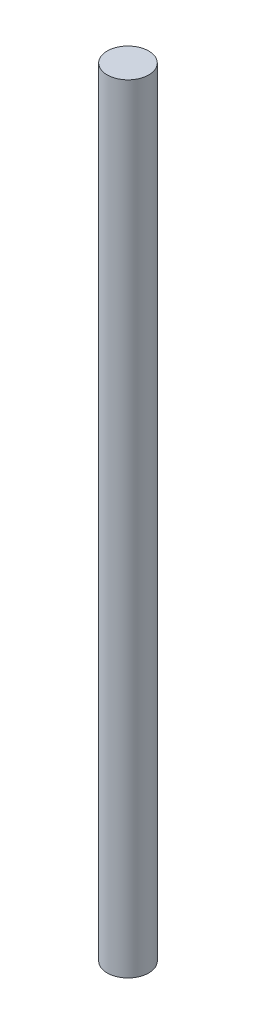
ISO-10303-21;
HEADER;
FILE_DESCRIPTION(('STEP AP214'),'2;1');
FILE_NAME('part.step','',(''),(''),'','','');
FILE_SCHEMA(('AUTOMOTIVE_DESIGN { 1 0 10303 214 1 1 1 1 }'));
ENDSEC;
DATA;
#1=APPLICATION_CONTEXT('core data for automotive mechanical design processes');
#2=APPLICATION_PROTOCOL_DEFINITION('international standard','automotive_design',2000,#1);
#3=PRODUCT_CONTEXT('',#1,'mechanical');
#4=PRODUCT('Part','Part','',(#3));
#5=PRODUCT_RELATED_PRODUCT_CATEGORY('part','',(#4));
#6=PRODUCT_DEFINITION_FORMATION('','',#4);
#7=PRODUCT_DEFINITION_CONTEXT('part definition',#1,'design');
#8=PRODUCT_DEFINITION('design','',#6,#7);
#9=PRODUCT_DEFINITION_SHAPE('','',#8);
#10=(LENGTH_UNIT() NAMED_UNIT(*) SI_UNIT(.MILLI.,.METRE.));
#11=(NAMED_UNIT(*) PLANE_ANGLE_UNIT() SI_UNIT($,.RADIAN.));
#12=(NAMED_UNIT(*) SI_UNIT($,.STERADIAN.) SOLID_ANGLE_UNIT());
#13=UNCERTAINTY_MEASURE_WITH_UNIT(LENGTH_MEASURE(1.E-05),#10,'distance_accuracy_value','');
#14=(GEOMETRIC_REPRESENTATION_CONTEXT(3) GLOBAL_UNCERTAINTY_ASSIGNED_CONTEXT((#13)) GLOBAL_UNIT_ASSIGNED_CONTEXT((#10,
#11,#12)) REPRESENTATION_CONTEXT('',''));
#15=CARTESIAN_POINT('',(0.,0.,0.));
#16=DIRECTION('',(0.,0.,1.));
#17=DIRECTION('',(1.,0.,0.));
#18=AXIS2_PLACEMENT_3D('',#15,#16,#17);
#19=CARTESIAN_POINT('',(0.,150.,0.));
#20=DIRECTION('',(0.,-1.,0.));
#21=DIRECTION('',(0.,0.,-1.));
#22=AXIS2_PLACEMENT_3D('',#19,#20,#21);
#23=CYLINDRICAL_SURFACE('',#22,4.);
#24=CARTESIAN_POINT('',(0.,150.,0.));
#25=DIRECTION('',(0.,1.,0.));
#26=DIRECTION('',(0.,0.,1.));
#27=AXIS2_PLACEMENT_3D('',#24,#25,#26);
#28=CIRCLE('',#27,4.);
#29=CARTESIAN_POINT('',(0.,150.,4.));
#30=VERTEX_POINT('',#29);
#31=EDGE_CURVE('E10',#30,#30,#28,.T.);
#32=ORIENTED_EDGE('',*,*,#31,.F.);
#33=EDGE_LOOP('',(#32));
#34=FACE_BOUND('',#33,.T.);
#35=CARTESIAN_POINT('',(0.,0.,0.));
#36=DIRECTION('',(0.,1.,0.));
#37=DIRECTION('',(0.,0.,1.));
#38=AXIS2_PLACEMENT_3D('',#35,#36,#37);
#39=CIRCLE('',#38,4.);
#40=CARTESIAN_POINT('',(0.,0.,4.));
#41=VERTEX_POINT('',#40);
#42=EDGE_CURVE('E34',#41,#41,#39,.T.);
#43=ORIENTED_EDGE('',*,*,#42,.T.);
#44=EDGE_LOOP('',(#43));
#45=FACE_BOUND('',#44,.T.);
#46=ADVANCED_FACE('F31',(#34,#45),#23,.T.);
#47=CARTESIAN_POINT('',(0.,150.,0.));
#48=DIRECTION('',(0.,1.,0.));
#49=DIRECTION('',(0.,0.,1.));
#50=AXIS2_PLACEMENT_3D('',#47,#48,#49);
#51=PLANE('',#50);
#52=ORIENTED_EDGE('',*,*,#31,.T.);
#53=EDGE_LOOP('',(#52));
#54=FACE_BOUND('',#53,.T.);
#55=ADVANCED_FACE('F46',(#54),#51,.T.);
#56=CARTESIAN_POINT('',(0.,0.,0.));
#57=DIRECTION('',(0.,1.,0.));
#58=DIRECTION('',(0.,0.,1.));
#59=AXIS2_PLACEMENT_3D('',#56,#57,#58);
#60=PLANE('',#59);
#61=ORIENTED_EDGE('',*,*,#42,.F.);
#62=EDGE_LOOP('',(#61));
#63=FACE_BOUND('',#62,.T.);
#64=ADVANCED_FACE('F44',(#63),#60,.F.);
#65=CLOSED_SHELL('',(#46,#55,#64));
#66=MANIFOLD_SOLID_BREP('B2',#65);
#67=ADVANCED_BREP_SHAPE_REPRESENTATION('',(#18,#66),#14);
#68=SHAPE_DEFINITION_REPRESENTATION(#9,#67);
ENDSEC;
END-ISO-10303-21;
